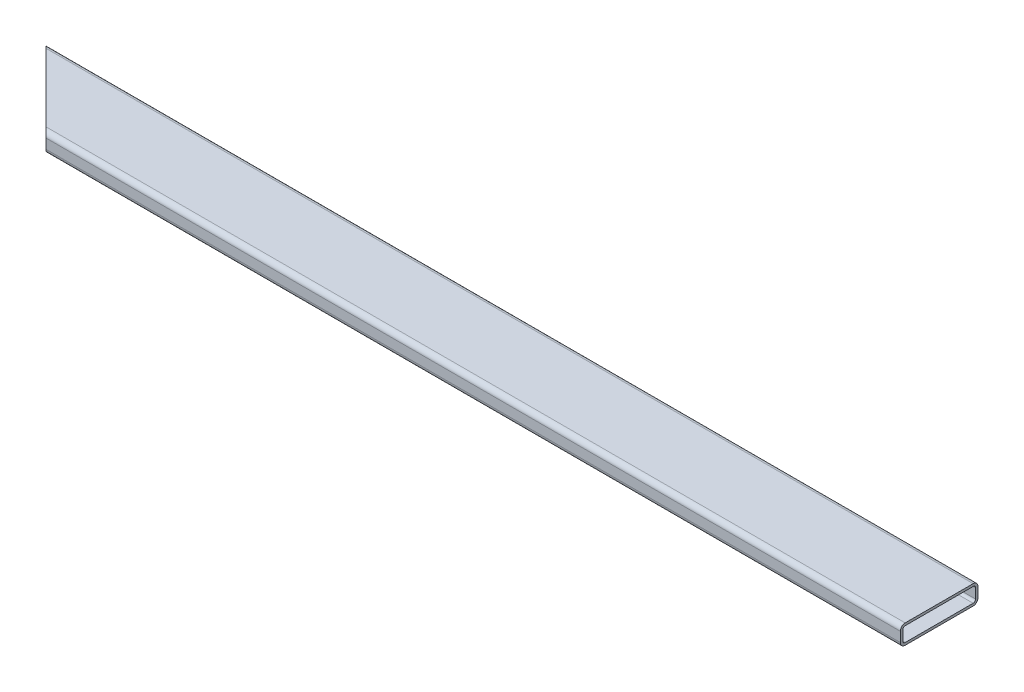
ISO-10303-21;
HEADER;
FILE_DESCRIPTION(('STEP AP214'),'2;1');
FILE_NAME('part.step','',(''),(''),'','','');
FILE_SCHEMA(('AUTOMOTIVE_DESIGN { 1 0 10303 214 1 1 1 1 }'));
ENDSEC;
DATA;
#1=APPLICATION_CONTEXT('core data for automotive mechanical design processes');
#2=APPLICATION_PROTOCOL_DEFINITION('international standard','automotive_design',2000,#1);
#3=PRODUCT_CONTEXT('',#1,'mechanical');
#4=PRODUCT('Part','Part','',(#3));
#5=PRODUCT_RELATED_PRODUCT_CATEGORY('part','',(#4));
#6=PRODUCT_DEFINITION_FORMATION('','',#4);
#7=PRODUCT_DEFINITION_CONTEXT('part definition',#1,'design');
#8=PRODUCT_DEFINITION('design','',#6,#7);
#9=PRODUCT_DEFINITION_SHAPE('','',#8);
#10=(LENGTH_UNIT() NAMED_UNIT(*) SI_UNIT(.MILLI.,.METRE.));
#11=(NAMED_UNIT(*) PLANE_ANGLE_UNIT() SI_UNIT($,.RADIAN.));
#12=(NAMED_UNIT(*) SI_UNIT($,.STERADIAN.) SOLID_ANGLE_UNIT());
#13=UNCERTAINTY_MEASURE_WITH_UNIT(LENGTH_MEASURE(1.E-05),#10,'distance_accuracy_value','');
#14=(GEOMETRIC_REPRESENTATION_CONTEXT(3) GLOBAL_UNCERTAINTY_ASSIGNED_CONTEXT((#13)) GLOBAL_UNIT_ASSIGNED_CONTEXT((#10,
#11,#12)) REPRESENTATION_CONTEXT('',''));
#15=CARTESIAN_POINT('',(0.,0.,0.));
#16=DIRECTION('',(0.,0.,1.));
#17=DIRECTION('',(1.,0.,0.));
#18=AXIS2_PLACEMENT_3D('',#15,#16,#17);
#19=CARTESIAN_POINT('',(1219.2,0.,0.));
#20=DIRECTION('',(0.,0.,-1.));
#21=DIRECTION('',(-1.,0.,0.));
#22=AXIS2_PLACEMENT_3D('',#19,#20,#21);
#23=PLANE('',#22);
#24=DIRECTION('',(-1.,0.,0.));
#25=VECTOR('',#24,1.);
#26=CARTESIAN_POINT('',(1219.2,19.05,0.));
#27=LINE('',#26,#25);
#28=CARTESIAN_POINT('',(1219.2,19.05,0.));
#29=VERTEX_POINT('',#28);
#30=CARTESIAN_POINT('',(101.6,19.05,0.));
#31=VERTEX_POINT('',#30);
#32=EDGE_CURVE('E170',#29,#31,#27,.T.);
#33=ORIENTED_EDGE('',*,*,#32,.T.);
#34=DIRECTION('',(0.,1.,0.));
#35=VECTOR('',#34,1.);
#36=CARTESIAN_POINT('',(101.6,0.,0.));
#37=LINE('',#36,#35);
#38=CARTESIAN_POINT('',(101.6,6.35,0.));
#39=VERTEX_POINT('',#38);
#40=EDGE_CURVE('E50',#39,#31,#37,.T.);
#41=ORIENTED_EDGE('',*,*,#40,.F.);
#42=DIRECTION('',(-1.,0.,0.));
#43=VECTOR('',#42,1.);
#44=CARTESIAN_POINT('',(1219.2,6.35,0.));
#45=LINE('',#44,#43);
#46=CARTESIAN_POINT('',(1219.2,6.35,0.));
#47=VERTEX_POINT('',#46);
#48=EDGE_CURVE('E43',#39,#47,#45,.F.);
#49=ORIENTED_EDGE('',*,*,#48,.T.);
#50=DIRECTION('',(0.,-1.,0.));
#51=VECTOR('',#50,1.);
#52=CARTESIAN_POINT('',(1219.2,0.,0.));
#53=LINE('',#52,#51);
#54=EDGE_CURVE('E180',#29,#47,#53,.T.);
#55=ORIENTED_EDGE('',*,*,#54,.F.);
#56=EDGE_LOOP('',(#33,#41,#49,#55));
#57=FACE_BOUND('',#56,.T.);
#58=ADVANCED_FACE('F35',(#57),#23,.F.);
#59=CARTESIAN_POINT('',(1219.2,0.,0.));
#60=DIRECTION('',(0.,1.,0.));
#61=DIRECTION('',(0.,0.,1.));
#62=AXIS2_PLACEMENT_3D('',#59,#60,#61);
#63=PLANE('',#62);
#64=DIRECTION('',(-1.,0.,0.));
#65=VECTOR('',#64,1.);
#66=CARTESIAN_POINT('',(1219.2,0.,-6.35));
#67=LINE('',#66,#65);
#68=CARTESIAN_POINT('',(1219.2,0.,-6.35));
#69=VERTEX_POINT('',#68);
#70=CARTESIAN_POINT('',(95.2499999999998,0.,-6.34999999999998));
#71=VERTEX_POINT('',#70);
#72=EDGE_CURVE('E195',#69,#71,#67,.T.);
#73=ORIENTED_EDGE('',*,*,#72,.T.);
#74=DIRECTION('',(-0.707106781186546,0.,-0.707106781186549));
#75=VECTOR('',#74,1.);
#76=CARTESIAN_POINT('',(0.,0.,-101.6));
#77=LINE('',#76,#75);
#78=CARTESIAN_POINT('',(6.35000000000005,0.,-95.25));
#79=VERTEX_POINT('',#78);
#80=EDGE_CURVE('E164',#71,#79,#77,.T.);
#81=ORIENTED_EDGE('',*,*,#80,.T.);
#82=DIRECTION('',(-1.,0.,0.));
#83=VECTOR('',#82,1.);
#84=CARTESIAN_POINT('',(1219.2,0.,-95.25));
#85=LINE('',#84,#83);
#86=CARTESIAN_POINT('',(1219.2,0.,-95.25));
#87=VERTEX_POINT('',#86);
#88=EDGE_CURVE('E197',#79,#87,#85,.F.);
#89=ORIENTED_EDGE('',*,*,#88,.T.);
#90=DIRECTION('',(0.,0.,-1.));
#91=VECTOR('',#90,1.);
#92=CARTESIAN_POINT('',(1219.2,0.,0.));
#93=LINE('',#92,#91);
#94=EDGE_CURVE('E189',#69,#87,#93,.T.);
#95=ORIENTED_EDGE('',*,*,#94,.F.);
#96=EDGE_LOOP('',(#73,#81,#89,#95));
#97=FACE_BOUND('',#96,.T.);
#98=ADVANCED_FACE('F279',(#97),#63,.F.);
#99=CARTESIAN_POINT('',(1219.2,0.,-101.6));
#100=DIRECTION('',(0.,0.,1.));
#101=DIRECTION('',(1.,0.,0.));
#102=AXIS2_PLACEMENT_3D('',#99,#100,#101);
#103=PLANE('',#102);
#104=DIRECTION('',(0.,1.,0.));
#105=VECTOR('',#104,1.);
#106=CARTESIAN_POINT('',(1219.2,0.,-101.6));
#107=LINE('',#106,#105);
#108=CARTESIAN_POINT('',(1219.2,6.35,-101.6));
#109=VERTEX_POINT('',#108);
#110=CARTESIAN_POINT('',(1219.2,19.05,-101.6));
#111=VERTEX_POINT('',#110);
#112=EDGE_CURVE('E212',#109,#111,#107,.T.);
#113=ORIENTED_EDGE('',*,*,#112,.F.);
#114=DIRECTION('',(-1.,0.,0.));
#115=VECTOR('',#114,1.);
#116=CARTESIAN_POINT('',(1219.2,6.35,-101.6));
#117=LINE('',#116,#115);
#118=CARTESIAN_POINT('',(0.,6.35,-101.6));
#119=VERTEX_POINT('',#118);
#120=EDGE_CURVE('E202',#109,#119,#117,.T.);
#121=ORIENTED_EDGE('',*,*,#120,.T.);
#122=DIRECTION('',(0.,1.,0.));
#123=VECTOR('',#122,1.);
#124=CARTESIAN_POINT('',(0.,0.,-101.6));
#125=LINE('',#124,#123);
#126=CARTESIAN_POINT('',(0.,19.05,-101.6));
#127=VERTEX_POINT('',#126);
#128=EDGE_CURVE('E190',#119,#127,#125,.T.);
#129=ORIENTED_EDGE('',*,*,#128,.T.);
#130=DIRECTION('',(-1.,0.,0.));
#131=VECTOR('',#130,1.);
#132=CARTESIAN_POINT('',(1219.2,19.05,-101.6));
#133=LINE('',#132,#131);
#134=EDGE_CURVE('E205',#127,#111,#133,.F.);
#135=ORIENTED_EDGE('',*,*,#134,.T.);
#136=EDGE_LOOP('',(#113,#121,#129,#135));
#137=FACE_BOUND('',#136,.T.);
#138=ADVANCED_FACE('F288',(#137),#103,.F.);
#139=CARTESIAN_POINT('',(1219.2,25.4,0.));
#140=DIRECTION('',(0.,-1.,0.));
#141=DIRECTION('',(0.,0.,-1.));
#142=AXIS2_PLACEMENT_3D('',#139,#140,#141);
#143=PLANE('',#142);
#144=DIRECTION('',(-1.,0.,0.));
#145=VECTOR('',#144,1.);
#146=CARTESIAN_POINT('',(1219.2,25.4,-95.25));
#147=LINE('',#146,#145);
#148=CARTESIAN_POINT('',(1219.2,25.4,-95.25));
#149=VERTEX_POINT('',#148);
#150=CARTESIAN_POINT('',(6.35000000000005,25.4,-95.25));
#151=VERTEX_POINT('',#150);
#152=EDGE_CURVE('E163',#149,#151,#147,.T.);
#153=ORIENTED_EDGE('',*,*,#152,.T.);
#154=DIRECTION('',(-0.707106781186546,0.,-0.707106781186549));
#155=VECTOR('',#154,1.);
#156=CARTESIAN_POINT('',(0.,25.4,-101.6));
#157=LINE('',#156,#155);
#158=CARTESIAN_POINT('',(95.2499999999998,25.4,-6.34999999999998));
#159=VERTEX_POINT('',#158);
#160=EDGE_CURVE('E147',#159,#151,#157,.T.);
#161=ORIENTED_EDGE('',*,*,#160,.F.);
#162=DIRECTION('',(-1.,0.,0.));
#163=VECTOR('',#162,1.);
#164=CARTESIAN_POINT('',(1219.2,25.4,-6.35));
#165=LINE('',#164,#163);
#166=CARTESIAN_POINT('',(1219.2,25.4,-6.35));
#167=VERTEX_POINT('',#166);
#168=EDGE_CURVE('E160',#159,#167,#165,.F.);
#169=ORIENTED_EDGE('',*,*,#168,.T.);
#170=DIRECTION('',(0.,0.,1.));
#171=VECTOR('',#170,1.);
#172=CARTESIAN_POINT('',(1219.2,25.4,0.));
#173=LINE('',#172,#171);
#174=EDGE_CURVE('E207',#149,#167,#173,.T.);
#175=ORIENTED_EDGE('',*,*,#174,.F.);
#176=EDGE_LOOP('',(#153,#161,#169,#175));
#177=FACE_BOUND('',#176,.T.);
#178=ADVANCED_FACE('F158',(#177),#143,.F.);
#179=CARTESIAN_POINT('',(1219.2,0.,0.));
#180=DIRECTION('',(-1.,0.,0.));
#181=DIRECTION('',(0.,0.,1.));
#182=AXIS2_PLACEMENT_3D('',#179,#180,#181);
#183=PLANE('',#182);
#184=DIRECTION('',(0.,0.,-1.));
#185=VECTOR('',#184,1.);
#186=CARTESIAN_POINT('',(1219.2,3.175,0.));
#187=LINE('',#186,#185);
#188=CARTESIAN_POINT('',(1219.2,3.175,-6.35));
#189=VERTEX_POINT('',#188);
#190=CARTESIAN_POINT('',(1219.2,3.175,-95.25));
#191=VERTEX_POINT('',#190);
#192=EDGE_CURVE('E230',#189,#191,#187,.T.);
#193=ORIENTED_EDGE('',*,*,#192,.F.);
#194=CARTESIAN_POINT('',(1219.2,6.35,-6.35));
#195=DIRECTION('',(-1.,0.,0.));
#196=DIRECTION('',(0.,0.,1.));
#197=AXIS2_PLACEMENT_3D('',#194,#195,#196);
#198=CIRCLE('',#197,3.175);
#199=CARTESIAN_POINT('',(1219.2,6.35,-3.175));
#200=VERTEX_POINT('',#199);
#201=EDGE_CURVE('E218',#200,#189,#198,.F.);
#202=ORIENTED_EDGE('',*,*,#201,.F.);
#203=DIRECTION('',(0.,-1.,0.));
#204=VECTOR('',#203,1.);
#205=CARTESIAN_POINT('',(1219.2,0.,-3.175));
#206=LINE('',#205,#204);
#207=CARTESIAN_POINT('',(1219.2,19.05,-3.175));
#208=VERTEX_POINT('',#207);
#209=EDGE_CURVE('E235',#208,#200,#206,.T.);
#210=ORIENTED_EDGE('',*,*,#209,.F.);
#211=CARTESIAN_POINT('',(1219.2,19.05,-6.35));
#212=DIRECTION('',(-1.,0.,0.));
#213=DIRECTION('',(0.,0.,1.));
#214=AXIS2_PLACEMENT_3D('',#211,#212,#213);
#215=CIRCLE('',#214,3.175);
#216=CARTESIAN_POINT('',(1219.2,22.225,-6.35));
#217=VERTEX_POINT('',#216);
#218=EDGE_CURVE('E216',#217,#208,#215,.F.);
#219=ORIENTED_EDGE('',*,*,#218,.F.);
#220=DIRECTION('',(0.,0.,1.));
#221=VECTOR('',#220,1.);
#222=CARTESIAN_POINT('',(1219.2,22.225,0.));
#223=LINE('',#222,#221);
#224=CARTESIAN_POINT('',(1219.2,22.225,-95.25));
#225=VERTEX_POINT('',#224);
#226=EDGE_CURVE('E220',#225,#217,#223,.T.);
#227=ORIENTED_EDGE('',*,*,#226,.F.);
#228=CARTESIAN_POINT('',(1219.2,19.05,-95.25));
#229=DIRECTION('',(-1.,0.,0.));
#230=DIRECTION('',(0.,0.,1.));
#231=AXIS2_PLACEMENT_3D('',#228,#229,#230);
#232=CIRCLE('',#231,3.175);
#233=CARTESIAN_POINT('',(1219.2,19.05,-98.425));
#234=VERTEX_POINT('',#233);
#235=EDGE_CURVE('E225',#234,#225,#232,.F.);
#236=ORIENTED_EDGE('',*,*,#235,.F.);
#237=DIRECTION('',(0.,1.,0.));
#238=VECTOR('',#237,1.);
#239=CARTESIAN_POINT('',(1219.2,0.,-98.425));
#240=LINE('',#239,#238);
#241=CARTESIAN_POINT('',(1219.2,6.35,-98.425));
#242=VERTEX_POINT('',#241);
#243=EDGE_CURVE('E224',#242,#234,#240,.T.);
#244=ORIENTED_EDGE('',*,*,#243,.F.);
#245=CARTESIAN_POINT('',(1219.2,6.35,-95.25));
#246=DIRECTION('',(-1.,0.,0.));
#247=DIRECTION('',(0.,0.,1.));
#248=AXIS2_PLACEMENT_3D('',#245,#246,#247);
#249=CIRCLE('',#248,3.175);
#250=EDGE_CURVE('E227',#191,#242,#249,.F.);
#251=ORIENTED_EDGE('',*,*,#250,.F.);
#252=EDGE_LOOP('',(#193,#202,#210,#219,#227,#236,#244,#251));
#253=FACE_BOUND('',#252,.T.);
#254=ORIENTED_EDGE('',*,*,#94,.T.);
#255=CARTESIAN_POINT('',(1219.2,6.35,-95.25));
#256=DIRECTION('',(-1.,0.,0.));
#257=DIRECTION('',(0.,0.,1.));
#258=AXIS2_PLACEMENT_3D('',#255,#256,#257);
#259=CIRCLE('',#258,6.35);
#260=EDGE_CURVE('E168',#87,#109,#259,.F.);
#261=ORIENTED_EDGE('',*,*,#260,.T.);
#262=ORIENTED_EDGE('',*,*,#112,.T.);
#263=CARTESIAN_POINT('',(1219.2,19.05,-95.25));
#264=DIRECTION('',(-1.,0.,0.));
#265=DIRECTION('',(0.,0.,1.));
#266=AXIS2_PLACEMENT_3D('',#263,#264,#265);
#267=CIRCLE('',#266,6.35);
#268=EDGE_CURVE('E172',#111,#149,#267,.F.);
#269=ORIENTED_EDGE('',*,*,#268,.T.);
#270=ORIENTED_EDGE('',*,*,#174,.T.);
#271=CARTESIAN_POINT('',(1219.2,19.05,-6.35));
#272=DIRECTION('',(-1.,0.,0.));
#273=DIRECTION('',(0.,0.,1.));
#274=AXIS2_PLACEMENT_3D('',#271,#272,#273);
#275=CIRCLE('',#274,6.35);
#276=EDGE_CURVE('E167',#167,#29,#275,.F.);
#277=ORIENTED_EDGE('',*,*,#276,.T.);
#278=ORIENTED_EDGE('',*,*,#54,.T.);
#279=CARTESIAN_POINT('',(1219.2,6.35,-6.35));
#280=DIRECTION('',(-1.,0.,0.));
#281=DIRECTION('',(0.,0.,1.));
#282=AXIS2_PLACEMENT_3D('',#279,#280,#281);
#283=CIRCLE('',#282,6.35);
#284=EDGE_CURVE('E187',#47,#69,#283,.F.);
#285=ORIENTED_EDGE('',*,*,#284,.T.);
#286=EDGE_LOOP('',(#254,#261,#262,#269,#270,#277,#278,#285));
#287=FACE_BOUND('',#286,.T.);
#288=ADVANCED_FACE('F186',(#253,#287),#183,.F.);
#289=CARTESIAN_POINT('',(1219.2,6.35,-95.25));
#290=DIRECTION('',(-1.,0.,0.));
#291=DIRECTION('',(0.,0.,1.));
#292=AXIS2_PLACEMENT_3D('',#289,#290,#291);
#293=CYLINDRICAL_SURFACE('',#292,6.35);
#294=CARTESIAN_POINT('',(6.35000000000008,6.35,-95.25));
#295=DIRECTION('',(0.707106781186548,0.,-0.707106781186546));
#296=DIRECTION('',(-0.707106781186547,0.,-0.707106781186549));
#297=AXIS2_PLACEMENT_3D('',#294,#295,#296);
#298=ELLIPSE('',#297,8.98025612106914,6.35);
#299=EDGE_CURVE('E239',#119,#79,#298,.F.);
#300=ORIENTED_EDGE('',*,*,#299,.F.);
#301=ORIENTED_EDGE('',*,*,#120,.F.);
#302=ORIENTED_EDGE('',*,*,#260,.F.);
#303=ORIENTED_EDGE('',*,*,#88,.F.);
#304=EDGE_LOOP('',(#300,#301,#302,#303));
#305=FACE_BOUND('',#304,.T.);
#306=ADVANCED_FACE('F283',(#305),#293,.T.);
#307=CARTESIAN_POINT('',(1219.2,19.05,-95.25));
#308=DIRECTION('',(-1.,0.,0.));
#309=DIRECTION('',(0.,0.,1.));
#310=AXIS2_PLACEMENT_3D('',#307,#308,#309);
#311=CYLINDRICAL_SURFACE('',#310,6.35);
#312=CARTESIAN_POINT('',(6.35000000000008,19.05,-95.25));
#313=DIRECTION('',(0.707106781186548,0.,-0.707106781186546));
#314=DIRECTION('',(-0.707106781186547,0.,-0.707106781186549));
#315=AXIS2_PLACEMENT_3D('',#312,#313,#314);
#316=ELLIPSE('',#315,8.98025612106914,6.35);
#317=EDGE_CURVE('E257',#151,#127,#316,.F.);
#318=ORIENTED_EDGE('',*,*,#317,.F.);
#319=ORIENTED_EDGE('',*,*,#152,.F.);
#320=ORIENTED_EDGE('',*,*,#268,.F.);
#321=ORIENTED_EDGE('',*,*,#134,.F.);
#322=EDGE_LOOP('',(#318,#319,#320,#321));
#323=FACE_BOUND('',#322,.T.);
#324=ADVANCED_FACE('F291',(#323),#311,.T.);
#325=CARTESIAN_POINT('',(1219.2,6.35,-6.35));
#326=DIRECTION('',(-1.,0.,0.));
#327=DIRECTION('',(0.,0.,1.));
#328=AXIS2_PLACEMENT_3D('',#325,#326,#327);
#329=CYLINDRICAL_SURFACE('',#328,6.35);
#330=CARTESIAN_POINT('',(95.2499999999996,6.35,-6.35));
#331=DIRECTION('',(0.707106781186548,0.,-0.707106781186546));
#332=DIRECTION('',(-0.707106781186547,0.,-0.707106781186549));
#333=AXIS2_PLACEMENT_3D('',#330,#331,#332);
#334=ELLIPSE('',#333,8.98025612106914,6.35);
#335=EDGE_CURVE('E153',#71,#39,#334,.F.);
#336=ORIENTED_EDGE('',*,*,#335,.F.);
#337=ORIENTED_EDGE('',*,*,#72,.F.);
#338=ORIENTED_EDGE('',*,*,#284,.F.);
#339=ORIENTED_EDGE('',*,*,#48,.F.);
#340=EDGE_LOOP('',(#336,#337,#338,#339));
#341=FACE_BOUND('',#340,.T.);
#342=ADVANCED_FACE('F193',(#341),#329,.T.);
#343=CARTESIAN_POINT('',(1219.2,19.05,-6.35));
#344=DIRECTION('',(-1.,0.,0.));
#345=DIRECTION('',(0.,0.,1.));
#346=AXIS2_PLACEMENT_3D('',#343,#344,#345);
#347=CYLINDRICAL_SURFACE('',#346,6.35);
#348=CARTESIAN_POINT('',(95.2499999999996,19.05,-6.35));
#349=DIRECTION('',(0.707106781186548,0.,-0.707106781186546));
#350=DIRECTION('',(-0.707106781186547,0.,-0.707106781186549));
#351=AXIS2_PLACEMENT_3D('',#348,#349,#350);
#352=ELLIPSE('',#351,8.98025612106914,6.35);
#353=EDGE_CURVE('E144',#31,#159,#352,.F.);
#354=ORIENTED_EDGE('',*,*,#353,.F.);
#355=ORIENTED_EDGE('',*,*,#32,.F.);
#356=ORIENTED_EDGE('',*,*,#276,.F.);
#357=ORIENTED_EDGE('',*,*,#168,.F.);
#358=EDGE_LOOP('',(#354,#355,#356,#357));
#359=FACE_BOUND('',#358,.T.);
#360=ADVANCED_FACE('F37',(#359),#347,.T.);
#361=CARTESIAN_POINT('',(1219.2,0.,-3.175));
#362=DIRECTION('',(0.,0.,-1.));
#363=DIRECTION('',(-1.,0.,0.));
#364=AXIS2_PLACEMENT_3D('',#361,#362,#363);
#365=PLANE('',#364);
#366=DIRECTION('',(0.,-1.,0.));
#367=VECTOR('',#366,1.);
#368=CARTESIAN_POINT('',(98.4249999999998,0.,-3.175));
#369=LINE('',#368,#367);
#370=CARTESIAN_POINT('',(98.4249999999995,19.05,-3.175));
#371=VERTEX_POINT('',#370);
#372=CARTESIAN_POINT('',(98.4249999999998,6.35,-3.175));
#373=VERTEX_POINT('',#372);
#374=EDGE_CURVE('E272',#371,#373,#369,.T.);
#375=ORIENTED_EDGE('',*,*,#374,.F.);
#376=DIRECTION('',(-1.,0.,0.));
#377=VECTOR('',#376,1.);
#378=CARTESIAN_POINT('',(1219.2,19.05,-3.175));
#379=LINE('',#378,#377);
#380=EDGE_CURVE('E244',#208,#371,#379,.T.);
#381=ORIENTED_EDGE('',*,*,#380,.F.);
#382=ORIENTED_EDGE('',*,*,#209,.T.);
#383=DIRECTION('',(-1.,0.,0.));
#384=VECTOR('',#383,1.);
#385=CARTESIAN_POINT('',(1219.2,6.35,-3.175));
#386=LINE('',#385,#384);
#387=EDGE_CURVE('E210',#373,#200,#386,.F.);
#388=ORIENTED_EDGE('',*,*,#387,.F.);
#389=EDGE_LOOP('',(#375,#381,#382,#388));
#390=FACE_BOUND('',#389,.T.);
#391=ADVANCED_FACE('F340',(#390),#365,.T.);
#392=CARTESIAN_POINT('',(1219.2,3.175,0.));
#393=DIRECTION('',(0.,1.,0.));
#394=DIRECTION('',(0.,0.,1.));
#395=AXIS2_PLACEMENT_3D('',#392,#393,#394);
#396=PLANE('',#395);
#397=DIRECTION('',(-0.707106781186546,0.,-0.707106781186548));
#398=VECTOR('',#397,1.);
#399=CARTESIAN_POINT('',(660.399999999998,3.175,558.8));
#400=LINE('',#399,#398);
#401=CARTESIAN_POINT('',(95.2499999999996,3.175,-6.35));
#402=VERTEX_POINT('',#401);
#403=CARTESIAN_POINT('',(6.34999999999986,3.175,-95.2499999999999));
#404=VERTEX_POINT('',#403);
#405=EDGE_CURVE('E262',#402,#404,#400,.T.);
#406=ORIENTED_EDGE('',*,*,#405,.F.);
#407=DIRECTION('',(1.,0.,0.));
#408=VECTOR('',#407,1.);
#409=CARTESIAN_POINT('',(1219.2,3.175,-6.35));
#410=LINE('',#409,#408);
#411=EDGE_CURVE('E249',#189,#402,#410,.F.);
#412=ORIENTED_EDGE('',*,*,#411,.F.);
#413=ORIENTED_EDGE('',*,*,#192,.T.);
#414=DIRECTION('',(1.,0.,0.));
#415=VECTOR('',#414,1.);
#416=CARTESIAN_POINT('',(1219.2,3.175,-95.25));
#417=LINE('',#416,#415);
#418=EDGE_CURVE('E219',#404,#191,#417,.T.);
#419=ORIENTED_EDGE('',*,*,#418,.F.);
#420=EDGE_LOOP('',(#406,#412,#413,#419));
#421=FACE_BOUND('',#420,.T.);
#422=ADVANCED_FACE('F336',(#421),#396,.T.);
#423=CARTESIAN_POINT('',(1219.2,0.,-98.425));
#424=DIRECTION('',(0.,0.,1.));
#425=DIRECTION('',(1.,0.,0.));
#426=AXIS2_PLACEMENT_3D('',#423,#424,#425);
#427=PLANE('',#426);
#428=DIRECTION('',(0.,1.,0.));
#429=VECTOR('',#428,1.);
#430=CARTESIAN_POINT('',(3.17499999999993,0.,-98.425));
#431=LINE('',#430,#429);
#432=CARTESIAN_POINT('',(3.17499999999993,6.35,-98.425));
#433=VERTEX_POINT('',#432);
#434=CARTESIAN_POINT('',(3.17500000000015,19.05,-98.425));
#435=VERTEX_POINT('',#434);
#436=EDGE_CURVE('E264',#433,#435,#431,.T.);
#437=ORIENTED_EDGE('',*,*,#436,.F.);
#438=DIRECTION('',(1.,0.,0.));
#439=VECTOR('',#438,1.);
#440=CARTESIAN_POINT('',(1219.2,6.35,-98.425));
#441=LINE('',#440,#439);
#442=EDGE_CURVE('E246',#242,#433,#441,.F.);
#443=ORIENTED_EDGE('',*,*,#442,.F.);
#444=ORIENTED_EDGE('',*,*,#243,.T.);
#445=DIRECTION('',(1.,0.,0.));
#446=VECTOR('',#445,1.);
#447=CARTESIAN_POINT('',(1219.2,19.05,-98.425));
#448=LINE('',#447,#446);
#449=EDGE_CURVE('E223',#435,#234,#448,.T.);
#450=ORIENTED_EDGE('',*,*,#449,.F.);
#451=EDGE_LOOP('',(#437,#443,#444,#450));
#452=FACE_BOUND('',#451,.T.);
#453=ADVANCED_FACE('F332',(#452),#427,.T.);
#454=CARTESIAN_POINT('',(1219.2,22.225,0.));
#455=DIRECTION('',(0.,-1.,0.));
#456=DIRECTION('',(0.,0.,-1.));
#457=AXIS2_PLACEMENT_3D('',#454,#455,#456);
#458=PLANE('',#457);
#459=DIRECTION('',(0.707106781186546,0.,0.707106781186548));
#460=VECTOR('',#459,1.);
#461=CARTESIAN_POINT('',(660.399999999998,22.225,558.8));
#462=LINE('',#461,#460);
#463=CARTESIAN_POINT('',(6.34999999999986,22.225,-95.2499999999999));
#464=VERTEX_POINT('',#463);
#465=CARTESIAN_POINT('',(95.2499999999996,22.225,-6.35));
#466=VERTEX_POINT('',#465);
#467=EDGE_CURVE('E58',#464,#466,#462,.T.);
#468=ORIENTED_EDGE('',*,*,#467,.F.);
#469=DIRECTION('',(1.,0.,0.));
#470=VECTOR('',#469,1.);
#471=CARTESIAN_POINT('',(1219.2,22.225,-95.25));
#472=LINE('',#471,#470);
#473=EDGE_CURVE('E241',#225,#464,#472,.F.);
#474=ORIENTED_EDGE('',*,*,#473,.F.);
#475=ORIENTED_EDGE('',*,*,#226,.T.);
#476=DIRECTION('',(1.,0.,0.));
#477=VECTOR('',#476,1.);
#478=CARTESIAN_POINT('',(1219.2,22.225,-6.35));
#479=LINE('',#478,#477);
#480=EDGE_CURVE('E232',#466,#217,#479,.T.);
#481=ORIENTED_EDGE('',*,*,#480,.F.);
#482=EDGE_LOOP('',(#468,#474,#475,#481));
#483=FACE_BOUND('',#482,.T.);
#484=ADVANCED_FACE('F328',(#483),#458,.T.);
#485=CARTESIAN_POINT('',(1219.2,6.35,-95.25));
#486=DIRECTION('',(-1.,0.,0.));
#487=DIRECTION('',(0.,0.,1.));
#488=AXIS2_PLACEMENT_3D('',#485,#486,#487);
#489=CYLINDRICAL_SURFACE('',#488,3.175);
#490=ORIENTED_EDGE('',*,*,#442,.T.);
#491=CARTESIAN_POINT('',(6.35000000000008,6.35,-95.25));
#492=DIRECTION('',(0.707106781186548,0.,-0.707106781186546));
#493=DIRECTION('',(-0.707106781186547,0.,-0.707106781186549));
#494=AXIS2_PLACEMENT_3D('',#491,#492,#493);
#495=ELLIPSE('',#494,4.49012806053457,3.175);
#496=EDGE_CURVE('E154',#433,#404,#495,.F.);
#497=ORIENTED_EDGE('',*,*,#496,.T.);
#498=ORIENTED_EDGE('',*,*,#418,.T.);
#499=ORIENTED_EDGE('',*,*,#250,.T.);
#500=EDGE_LOOP('',(#490,#497,#498,#499));
#501=FACE_BOUND('',#500,.T.);
#502=ADVANCED_FACE('F324',(#501),#489,.F.);
#503=CARTESIAN_POINT('',(1219.2,19.05,-95.25));
#504=DIRECTION('',(-1.,0.,0.));
#505=DIRECTION('',(0.,0.,1.));
#506=AXIS2_PLACEMENT_3D('',#503,#504,#505);
#507=CYLINDRICAL_SURFACE('',#506,3.175);
#508=ORIENTED_EDGE('',*,*,#473,.T.);
#509=CARTESIAN_POINT('',(6.35000000000008,19.05,-95.25));
#510=DIRECTION('',(0.707106781186548,0.,-0.707106781186546));
#511=DIRECTION('',(-0.707106781186547,0.,-0.707106781186549));
#512=AXIS2_PLACEMENT_3D('',#509,#510,#511);
#513=ELLIPSE('',#512,4.49012806053457,3.175);
#514=EDGE_CURVE('E266',#464,#435,#513,.F.);
#515=ORIENTED_EDGE('',*,*,#514,.T.);
#516=ORIENTED_EDGE('',*,*,#449,.T.);
#517=ORIENTED_EDGE('',*,*,#235,.T.);
#518=EDGE_LOOP('',(#508,#515,#516,#517));
#519=FACE_BOUND('',#518,.T.);
#520=ADVANCED_FACE('F320',(#519),#507,.F.);
#521=CARTESIAN_POINT('',(1219.2,6.35,-6.35));
#522=DIRECTION('',(-1.,0.,0.));
#523=DIRECTION('',(0.,0.,1.));
#524=AXIS2_PLACEMENT_3D('',#521,#522,#523);
#525=CYLINDRICAL_SURFACE('',#524,3.175);
#526=ORIENTED_EDGE('',*,*,#411,.T.);
#527=CARTESIAN_POINT('',(95.2499999999996,6.35,-6.35));
#528=DIRECTION('',(0.707106781186548,0.,-0.707106781186546));
#529=DIRECTION('',(-0.707106781186547,0.,-0.707106781186549));
#530=AXIS2_PLACEMENT_3D('',#527,#528,#529);
#531=ELLIPSE('',#530,4.49012806053457,3.175);
#532=EDGE_CURVE('E269',#402,#373,#531,.F.);
#533=ORIENTED_EDGE('',*,*,#532,.T.);
#534=ORIENTED_EDGE('',*,*,#387,.T.);
#535=ORIENTED_EDGE('',*,*,#201,.T.);
#536=EDGE_LOOP('',(#526,#533,#534,#535));
#537=FACE_BOUND('',#536,.T.);
#538=ADVANCED_FACE('F316',(#537),#525,.F.);
#539=CARTESIAN_POINT('',(1219.2,19.05,-6.35));
#540=DIRECTION('',(-1.,0.,0.));
#541=DIRECTION('',(0.,0.,1.));
#542=AXIS2_PLACEMENT_3D('',#539,#540,#541);
#543=CYLINDRICAL_SURFACE('',#542,3.175);
#544=ORIENTED_EDGE('',*,*,#380,.T.);
#545=CARTESIAN_POINT('',(95.2499999999996,19.05,-6.35));
#546=DIRECTION('',(0.707106781186548,0.,-0.707106781186546));
#547=DIRECTION('',(-0.707106781186547,0.,-0.707106781186549));
#548=AXIS2_PLACEMENT_3D('',#545,#546,#547);
#549=ELLIPSE('',#548,4.49012806053457,3.175);
#550=EDGE_CURVE('E11',#371,#466,#549,.F.);
#551=ORIENTED_EDGE('',*,*,#550,.T.);
#552=ORIENTED_EDGE('',*,*,#480,.T.);
#553=ORIENTED_EDGE('',*,*,#218,.T.);
#554=EDGE_LOOP('',(#544,#551,#552,#553));
#555=FACE_BOUND('',#554,.T.);
#556=ADVANCED_FACE('F313',(#555),#543,.F.);
#557=CARTESIAN_POINT('',(0.,0.,-101.6));
#558=DIRECTION('',(0.707106781186548,0.,-0.707106781186546));
#559=DIRECTION('',(-0.707106781186547,0.,-0.707106781186549));
#560=AXIS2_PLACEMENT_3D('',#557,#558,#559);
#561=PLANE('',#560);
#562=ORIENTED_EDGE('',*,*,#299,.T.);
#563=ORIENTED_EDGE('',*,*,#80,.F.);
#564=ORIENTED_EDGE('',*,*,#335,.T.);
#565=ORIENTED_EDGE('',*,*,#40,.T.);
#566=ORIENTED_EDGE('',*,*,#353,.T.);
#567=ORIENTED_EDGE('',*,*,#160,.T.);
#568=ORIENTED_EDGE('',*,*,#317,.T.);
#569=ORIENTED_EDGE('',*,*,#128,.F.);
#570=EDGE_LOOP('',(#562,#563,#564,#565,#566,#567,#568,#569));
#571=FACE_BOUND('',#570,.T.);
#572=ORIENTED_EDGE('',*,*,#436,.T.);
#573=ORIENTED_EDGE('',*,*,#514,.F.);
#574=ORIENTED_EDGE('',*,*,#467,.T.);
#575=ORIENTED_EDGE('',*,*,#550,.F.);
#576=ORIENTED_EDGE('',*,*,#374,.T.);
#577=ORIENTED_EDGE('',*,*,#532,.F.);
#578=ORIENTED_EDGE('',*,*,#405,.T.);
#579=ORIENTED_EDGE('',*,*,#496,.F.);
#580=EDGE_LOOP('',(#572,#573,#574,#575,#576,#577,#578,#579));
#581=FACE_BOUND('',#580,.T.);
#582=ADVANCED_FACE('F146',(#571,#581),#561,.F.);
#583=CLOSED_SHELL('',(#58,#98,#138,#178,#288,#306,#324,#342,#360,#391,#422,#453,#484,#502,#520,
#538,#556,#582));
#584=MANIFOLD_SOLID_BREP('B2',#583);
#585=ADVANCED_BREP_SHAPE_REPRESENTATION('',(#18,#584),#14);
#586=SHAPE_DEFINITION_REPRESENTATION(#9,#585);
ENDSEC;
END-ISO-10303-21;
